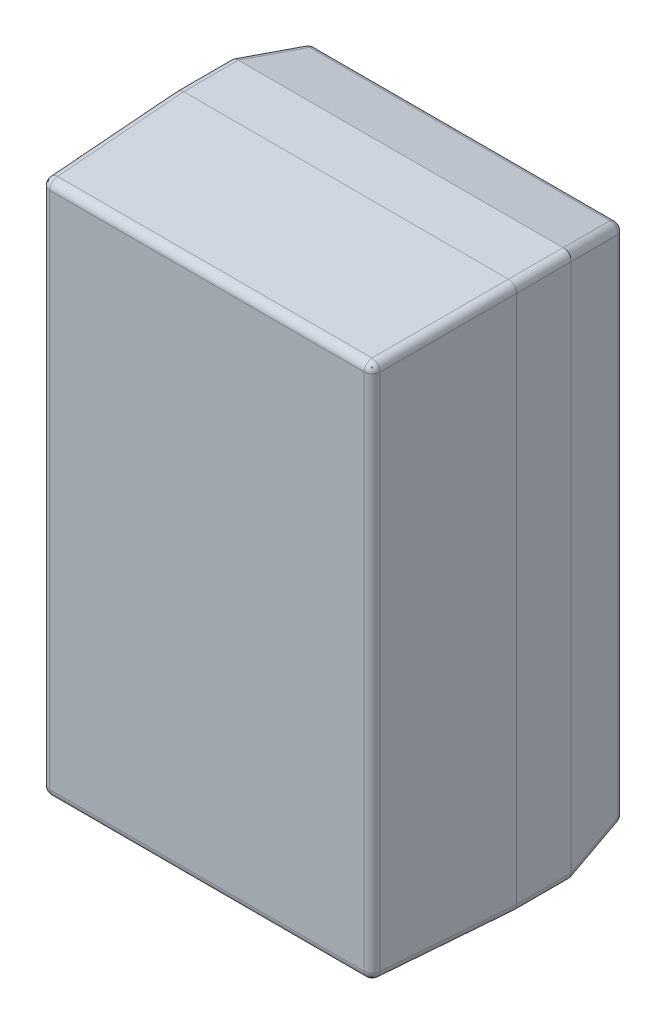
ISO-10303-21;
HEADER;
FILE_DESCRIPTION(('STEP AP214'),'2;1');
FILE_NAME('part.step','',(''),(''),'','','');
FILE_SCHEMA(('AUTOMOTIVE_DESIGN { 1 0 10303 214 1 1 1 1 }'));
ENDSEC;
DATA;
#1=APPLICATION_CONTEXT('core data for automotive mechanical design processes');
#2=APPLICATION_PROTOCOL_DEFINITION('international standard','automotive_design',2000,#1);
#3=PRODUCT_CONTEXT('',#1,'mechanical');
#4=PRODUCT('Part','Part','',(#3));
#5=PRODUCT_RELATED_PRODUCT_CATEGORY('part','',(#4));
#6=PRODUCT_DEFINITION_FORMATION('','',#4);
#7=PRODUCT_DEFINITION_CONTEXT('part definition',#1,'design');
#8=PRODUCT_DEFINITION('design','',#6,#7);
#9=PRODUCT_DEFINITION_SHAPE('','',#8);
#10=(LENGTH_UNIT() NAMED_UNIT(*) SI_UNIT(.MILLI.,.METRE.));
#11=(NAMED_UNIT(*) PLANE_ANGLE_UNIT() SI_UNIT($,.RADIAN.));
#12=(NAMED_UNIT(*) SI_UNIT($,.STERADIAN.) SOLID_ANGLE_UNIT());
#13=UNCERTAINTY_MEASURE_WITH_UNIT(LENGTH_MEASURE(1.E-05),#10,'distance_accuracy_value','');
#14=(GEOMETRIC_REPRESENTATION_CONTEXT(3) GLOBAL_UNCERTAINTY_ASSIGNED_CONTEXT((#13)) GLOBAL_UNIT_ASSIGNED_CONTEXT((#10,
#11,#12)) REPRESENTATION_CONTEXT('',''));
#15=CARTESIAN_POINT('',(0.,0.,0.));
#16=DIRECTION('',(0.,0.,1.));
#17=DIRECTION('',(1.,0.,0.));
#18=AXIS2_PLACEMENT_3D('',#15,#16,#17);
#19=CARTESIAN_POINT('',(0.69939346668,3.07439355148,-2.581602148866));
#20=DIRECTION('',(-0.495788828813103,-0.495788766478835,-0.713012577909763));
#21=DIRECTION('',(-2.39253061806721E-13,-0.821023932129786,0.570893775469784));
#22=AXIS2_PLACEMENT_3D('',#19,#20,#21);
#23=SPHERICAL_SURFACE('',#22,0.03);
#24=CARTESIAN_POINT('',(0.684519801815607,3.05951988848564,-2.60299252620329));
#25=VERTEX_POINT('',#24);
#26=VERTEX_LOOP('',#25);
#27=FACE_BOUND('',#26,.T.);
#28=CARTESIAN_POINT('',(0.699393466680533,3.07439355148056,-2.58160214886647));
#29=DIRECTION('',(0.199840191744084,0.199840275603084,-0.959232902902403));
#30=DIRECTION('',(0.,0.978980401907373,0.203954339697095));
#31=AXIS2_PLACEMENT_3D('',#28,#29,#30);
#32=CIRCLE('',#31,0.03);
#33=CARTESIAN_POINT('',(0.670024021774446,3.07439392426915,-2.58772062138399));
#34=VERTEX_POINT('',#33);
#35=CARTESIAN_POINT('',(0.699393466680054,3.04502413942317,-2.58772077905723));
#36=VERTEX_POINT('',#35);
#37=EDGE_CURVE('E132',#34,#36,#32,.F.);
#38=ORIENTED_EDGE('',*,*,#37,.F.);
#39=CARTESIAN_POINT('',(0.69939346668,3.07439355148032,-2.58160214886634));
#40=DIRECTION('',(0.,-0.999999999999996,-8.74227766353597E-08));
#41=DIRECTION('',(0.,8.74227766353597E-08,-0.999999999999996));
#42=AXIS2_PLACEMENT_3D('',#39,#40,#41);
#43=CIRCLE('',#42,0.03);
#44=CARTESIAN_POINT('',(0.69939346668,3.07439355410284,-2.61160214886617));
#45=VERTEX_POINT('',#44);
#46=EDGE_CURVE('E134',#45,#34,#43,.F.);
#47=ORIENTED_EDGE('',*,*,#46,.F.);
#48=CARTESIAN_POINT('',(0.69939346668,3.07439355148,-2.581602148866));
#49=DIRECTION('',(1.,0.,0.));
#50=DIRECTION('',(0.,1.,0.));
#51=AXIS2_PLACEMENT_3D('',#48,#49,#50);
#52=CIRCLE('',#51,0.03);
#53=EDGE_CURVE('E136',#36,#45,#52,.T.);
#54=ORIENTED_EDGE('',*,*,#53,.F.);
#55=EDGE_LOOP('',(#38,#47,#54));
#56=FACE_BOUND('',#55,.T.);
#57=ADVANCED_FACE('F17',(#27,#56),#23,.T.);
#58=CARTESIAN_POINT('',(0.69939346668,4.92560529812,-2.581601987028));
#59=DIRECTION('',(-0.495788828813108,0.495788891146105,-0.71301249122315));
#60=DIRECTION('',(4.70734562441066E-13,-0.8210238323113,-0.570893919022497));
#61=AXIS2_PLACEMENT_3D('',#58,#59,#60);
#62=SPHERICAL_SURFACE('',#61,0.03);
#63=CARTESIAN_POINT('',(0.684519801815607,4.94047896485438,-2.60299236176469));
#64=VERTEX_POINT('',#63);
#65=VERTEX_LOOP('',#64);
#66=FACE_BOUND('',#65,.T.);
#67=CARTESIAN_POINT('',(0.699393466679999,4.92560529812009,-2.58160198702827));
#68=DIRECTION('',(0.,-0.999999999999996,-8.74227766353597E-08));
#69=DIRECTION('',(0.,8.74227766353597E-08,-0.999999999999996));
#70=AXIS2_PLACEMENT_3D('',#67,#68,#69);
#71=CIRCLE('',#70,0.03);
#72=CARTESIAN_POINT('',(0.670024054088028,4.92560529865505,-2.58772061465177));
#73=VERTEX_POINT('',#72);
#74=CARTESIAN_POINT('',(0.69939346668,4.92560530074239,-2.61160198702814));
#75=VERTEX_POINT('',#74);
#76=EDGE_CURVE('E231',#73,#75,#71,.T.);
#77=ORIENTED_EDGE('',*,*,#76,.F.);
#78=CARTESIAN_POINT('',(0.699393466680197,4.9256052981197,-2.58160198702808));
#79=DIRECTION('',(-0.199840191744092,0.199840107886092,0.959232937843442));
#80=DIRECTION('',(0.978980420479347,0.,0.203954250551637));
#81=AXIS2_PLACEMENT_3D('',#78,#79,#80);
#82=CIRCLE('',#81,0.03);
#83=CARTESIAN_POINT('',(0.69939346668,4.95497471124687,-2.58772061208397));
#84=VERTEX_POINT('',#83);
#85=EDGE_CURVE('E226',#84,#73,#82,.T.);
#86=ORIENTED_EDGE('',*,*,#85,.F.);
#87=CARTESIAN_POINT('',(0.69939346668,4.92560529812,-2.581601987028));
#88=DIRECTION('',(-1.,0.,0.));
#89=DIRECTION('',(0.,-1.,0.));
#90=AXIS2_PLACEMENT_3D('',#87,#88,#89);
#91=CIRCLE('',#90,0.03);
#92=EDGE_CURVE('E141',#75,#84,#91,.F.);
#93=ORIENTED_EDGE('',*,*,#92,.F.);
#94=EDGE_LOOP('',(#77,#86,#93));
#95=FACE_BOUND('',#94,.T.);
#96=ADVANCED_FACE('F128',(#66,#95),#62,.T.);
#97=CARTESIAN_POINT('',(1.80060521332,3.07439355148,-2.581602148866));
#98=DIRECTION('',(0.495788828813103,-0.495788766478835,-0.713012577909763));
#99=DIRECTION('',(2.39253061806721E-13,-0.821023932129786,0.570893775469784));
#100=AXIS2_PLACEMENT_3D('',#97,#98,#99);
#101=SPHERICAL_SURFACE('',#100,0.03);
#102=CARTESIAN_POINT('',(1.81547887818439,3.05951988848564,-2.60299252620329));
#103=VERTEX_POINT('',#102);
#104=VERTEX_LOOP('',#103);
#105=FACE_BOUND('',#104,.T.);
#106=CARTESIAN_POINT('',(1.80060521331983,3.07439355147999,-2.5816021488661));
#107=DIRECTION('',(-0.199840191744084,0.199840275603084,-0.959232902902403));
#108=DIRECTION('',(0.,0.978980401907373,0.203954339697095));
#109=AXIS2_PLACEMENT_3D('',#106,#107,#108);
#110=CIRCLE('',#109,0.03);
#111=CARTESIAN_POINT('',(1.80060521332,3.04502413942289,-2.58772077905702));
#112=VERTEX_POINT('',#111);
#113=CARTESIAN_POINT('',(1.82997462591201,3.07439355201495,-2.58772077648973));
#114=VERTEX_POINT('',#113);
#115=EDGE_CURVE('E330',#112,#114,#110,.F.);
#116=ORIENTED_EDGE('',*,*,#115,.F.);
#117=CARTESIAN_POINT('',(1.80060521332,3.07439355148,-2.581602148866));
#118=DIRECTION('',(1.,0.,0.));
#119=DIRECTION('',(0.,1.,0.));
#120=AXIS2_PLACEMENT_3D('',#117,#118,#119);
#121=CIRCLE('',#120,0.03);
#122=CARTESIAN_POINT('',(1.80060521332,3.07439355410284,-2.61160214886636));
#123=VERTEX_POINT('',#122);
#124=EDGE_CURVE('E21',#123,#112,#121,.F.);
#125=ORIENTED_EDGE('',*,*,#124,.F.);
#126=CARTESIAN_POINT('',(1.80060521332,3.07439355148009,-2.58160214886673));
#127=DIRECTION('',(0.,0.999999999999996,8.74227766353597E-08));
#128=DIRECTION('',(0.,-8.74227766353597E-08,0.999999999999996));
#129=AXIS2_PLACEMENT_3D('',#126,#127,#128);
#130=CIRCLE('',#129,0.03);
#131=EDGE_CURVE('E325',#114,#123,#130,.T.);
#132=ORIENTED_EDGE('',*,*,#131,.F.);
#133=EDGE_LOOP('',(#116,#125,#132));
#134=FACE_BOUND('',#133,.T.);
#135=ADVANCED_FACE('F215',(#105,#134),#101,.T.);
#136=CARTESIAN_POINT('',(1.24999934,3.999999427423,-2.611602067947));
#137=DIRECTION('',(0.,8.74227766353597E-08,-0.999999999999996));
#138=DIRECTION('',(0.,0.999999999999996,8.74227766353597E-08));
#139=AXIS2_PLACEMENT_3D('',#136,#137,#138);
#140=PLANE('',#139);
#141=DIRECTION('',(-1.,0.,0.));
#142=VECTOR('',#141,1.);
#143=CARTESIAN_POINT('',(1.09374934,4.925605300742,-2.611601987028));
#144=LINE('',#143,#142);
#145=CARTESIAN_POINT('',(1.80060521332,4.92560530074234,-2.61160198702833));
#146=VERTEX_POINT('',#145);
#147=EDGE_CURVE('E224',#146,#75,#144,.T.);
#148=ORIENTED_EDGE('',*,*,#147,.F.);
#149=DIRECTION('',(0.,0.999999999999996,8.74227766353597E-08));
#150=VECTOR('',#149,1.);
#151=CARTESIAN_POINT('',(1.80060521332,4.24999942742268,-2.611602046092));
#152=LINE('',#151,#150);
#153=EDGE_CURVE('E223',#123,#146,#152,.T.);
#154=ORIENTED_EDGE('',*,*,#153,.F.);
#155=DIRECTION('',(1.,0.,0.));
#156=VECTOR('',#155,1.);
#157=CARTESIAN_POINT('',(1.40624934,3.074393554103,-2.611602148866));
#158=LINE('',#157,#156);
#159=EDGE_CURVE('E110',#45,#123,#158,.T.);
#160=ORIENTED_EDGE('',*,*,#159,.F.);
#161=DIRECTION('',(0.,-0.999999999999996,-8.74227766353597E-08));
#162=VECTOR('',#161,1.);
#163=CARTESIAN_POINT('',(0.69939346668,3.74999942742268,-2.611602089803));
#164=LINE('',#163,#162);
#165=EDGE_CURVE('E142',#75,#45,#164,.T.);
#166=ORIENTED_EDGE('',*,*,#165,.F.);
#167=EDGE_LOOP('',(#148,#154,#160,#166));
#168=FACE_BOUND('',#167,.T.);
#169=ADVANCED_FACE('F211',(#168),#140,.T.);
#170=CARTESIAN_POINT('',(1.80060521332,4.92560529812,-2.581601987028));
#171=DIRECTION('',(0.495788828813108,0.495788891146105,-0.71301249122315));
#172=DIRECTION('',(-4.70734562441066E-13,-0.8210238323113,-0.570893919022497));
#173=AXIS2_PLACEMENT_3D('',#170,#171,#172);
#174=SPHERICAL_SURFACE('',#173,0.03);
#175=CARTESIAN_POINT('',(1.81547887818439,4.94047896485438,-2.60299236176469));
#176=VERTEX_POINT('',#175);
#177=VERTEX_LOOP('',#176);
#178=FACE_BOUND('',#177,.T.);
#179=CARTESIAN_POINT('',(1.8006052133193,4.92560529811935,-2.58160198702837));
#180=DIRECTION('',(-0.199840191744092,-0.199840107886092,-0.959232937843442));
#181=DIRECTION('',(-0.978980420479347,0.,0.203954250551637));
#182=AXIS2_PLACEMENT_3D('',#179,#180,#181);
#183=CIRCLE('',#182,0.03);
#184=CARTESIAN_POINT('',(1.82997459359801,4.9256056709095,-2.58772076975792));
#185=VERTEX_POINT('',#184);
#186=CARTESIAN_POINT('',(1.80060521331996,4.95497471124655,-2.58772061208413));
#187=VERTEX_POINT('',#186);
#188=EDGE_CURVE('E180',#185,#187,#183,.F.);
#189=ORIENTED_EDGE('',*,*,#188,.F.);
#190=CARTESIAN_POINT('',(1.80060521332,4.92560529811932,-2.58160198702866));
#191=DIRECTION('',(0.,0.999999999999996,8.74227766353597E-08));
#192=DIRECTION('',(0.,-8.74227766353597E-08,0.999999999999996));
#193=AXIS2_PLACEMENT_3D('',#190,#191,#192);
#194=CIRCLE('',#193,0.03);
#195=EDGE_CURVE('E328',#146,#185,#194,.F.);
#196=ORIENTED_EDGE('',*,*,#195,.F.);
#197=CARTESIAN_POINT('',(1.80060521332,4.92560529812,-2.581601987028));
#198=DIRECTION('',(-1.,0.,0.));
#199=DIRECTION('',(0.,-1.,0.));
#200=AXIS2_PLACEMENT_3D('',#197,#198,#199);
#201=CIRCLE('',#200,0.03);
#202=EDGE_CURVE('E227',#187,#146,#201,.T.);
#203=ORIENTED_EDGE('',*,*,#202,.F.);
#204=EDGE_LOOP('',(#189,#196,#203));
#205=FACE_BOUND('',#204,.T.);
#206=ADVANCED_FACE('F206',(#178,#205),#174,.T.);
#207=CARTESIAN_POINT('',(1.40624934,3.07439355148,-2.581602148866));
#208=DIRECTION('',(1.,0.,0.));
#209=DIRECTION('',(0.,1.,0.));
#210=AXIS2_PLACEMENT_3D('',#207,#208,#209);
#211=CYLINDRICAL_SURFACE('',#210,0.03);
#212=ORIENTED_EDGE('',*,*,#53,.T.);
#213=ORIENTED_EDGE('',*,*,#159,.T.);
#214=ORIENTED_EDGE('',*,*,#124,.T.);
#215=DIRECTION('',(1.,0.,0.));
#216=VECTOR('',#215,1.);
#217=CARTESIAN_POINT('',(1.56249934,3.04502413942299,-2.587720779057));
#218=LINE('',#217,#216);
#219=EDGE_CURVE('E175',#36,#112,#218,.T.);
#220=ORIENTED_EDGE('',*,*,#219,.F.);
#221=EDGE_LOOP('',(#212,#213,#214,#220));
#222=FACE_BOUND('',#221,.T.);
#223=ADVANCED_FACE('F210',(#222),#211,.T.);
#224=CARTESIAN_POINT('',(0.69939346668,3.7499994248,-2.581602089803));
#225=DIRECTION('',(0.,-0.999999999999996,-8.74227766353597E-08));
#226=DIRECTION('',(0.,8.74227766353597E-08,-0.999999999999996));
#227=AXIS2_PLACEMENT_3D('',#224,#225,#226);
#228=CYLINDRICAL_SURFACE('',#227,0.03);
#229=ORIENTED_EDGE('',*,*,#76,.T.);
#230=ORIENTED_EDGE('',*,*,#165,.T.);
#231=ORIENTED_EDGE('',*,*,#46,.T.);
#232=DIRECTION('',(1.74554622238911E-08,1.,3.63655462997583E-09));
#233=VECTOR('',#232,1.);
#234=CARTESIAN_POINT('',(0.670024029203586,3.499999416932,-2.58772061983625));
#235=LINE('',#234,#233);
#236=EDGE_CURVE('E156',#73,#34,#235,.F.);
#237=ORIENTED_EDGE('',*,*,#236,.F.);
#238=EDGE_LOOP('',(#229,#230,#231,#237));
#239=FACE_BOUND('',#238,.T.);
#240=ADVANCED_FACE('F551',(#239),#228,.T.);
#241=CARTESIAN_POINT('',(0.705901523655,3.080901611186,-2.612840821775));
#242=DIRECTION('',(0.199840191744084,0.199840275603084,-0.959232902902403));
#243=DIRECTION('',(0.,0.978980401907373,0.203954339697095));
#244=AXIS2_PLACEMENT_3D('',#241,#242,#243);
#245=CYLINDRICAL_SURFACE('',#244,0.03);
#246=DIRECTION('',(0.199840191745187,0.199840275603023,-0.959232902902186));
#247=VECTOR('',#246,1.);
#248=CARTESIAN_POINT('',(0.654375244873,3.00000589872524,-2.37163331831995));
#249=LINE('',#248,#247);
#250=CARTESIAN_POINT('',(0.654687292436501,3.00000265258324,-2.37161773684497));
#251=VERTEX_POINT('',#250);
#252=EDGE_CURVE('E178',#251,#36,#249,.T.);
#253=ORIENTED_EDGE('',*,*,#252,.F.);
#254=CARTESIAN_POINT('',(0.654999339999994,3.02999940617088,-2.3685103446806));
#255=DIRECTION('',(0.10095429612821,0.100954382655504,-0.98975574901887));
#256=DIRECTION('',(-0.69986300808999,-0.69986299560924,-0.14277099594838));
#257=AXIS2_PLACEMENT_3D('',#254,#255,#256);
#258=ELLIPSE('',#257,0.0303105081857083,0.03);
#259=CARTESIAN_POINT('',(0.625002586140661,3.029687358879,-2.37161764944948));
#260=VERTEX_POINT('',#259);
#261=EDGE_CURVE('E150',#260,#251,#258,.F.);
#262=ORIENTED_EDGE('',*,*,#261,.F.);
#263=DIRECTION('',(-0.199840191744275,-0.199840275603291,0.95923290290232));
#264=VECTOR('',#263,1.);
#265=CARTESIAN_POINT('',(0.670024054088183,3.074393552015,-2.58772077648996));
#266=LINE('',#265,#264);
#267=EDGE_CURVE('E146',#34,#260,#266,.T.);
#268=ORIENTED_EDGE('',*,*,#267,.F.);
#269=ORIENTED_EDGE('',*,*,#37,.T.);
#270=EDGE_LOOP('',(#253,#262,#268,#269));
#271=FACE_BOUND('',#270,.T.);
#272=ADVANCED_FACE('F147',(#271),#245,.T.);
#273=CARTESIAN_POINT('',(1.09374934,4.92560529812,-2.581601987028));
#274=DIRECTION('',(-1.,0.,0.));
#275=DIRECTION('',(0.,-1.,0.));
#276=AXIS2_PLACEMENT_3D('',#273,#274,#275);
#277=CYLINDRICAL_SURFACE('',#276,0.03);
#278=ORIENTED_EDGE('',*,*,#202,.T.);
#279=ORIENTED_EDGE('',*,*,#147,.T.);
#280=ORIENTED_EDGE('',*,*,#92,.T.);
#281=DIRECTION('',(1.,0.,0.));
#282=VECTOR('',#281,1.);
#283=CARTESIAN_POINT('',(0.93749934,4.95497471124675,-2.58772061208395));
#284=LINE('',#283,#282);
#285=EDGE_CURVE('E195',#187,#84,#284,.F.);
#286=ORIENTED_EDGE('',*,*,#285,.F.);
#287=EDGE_LOOP('',(#278,#279,#280,#286));
#288=FACE_BOUND('',#287,.T.);
#289=ADVANCED_FACE('F545',(#288),#277,.T.);
#290=CARTESIAN_POINT('',(0.713389542824,4.911609227849,-2.648783153742));
#291=DIRECTION('',(-0.199840191744092,0.199840107886092,0.959232937843442));
#292=DIRECTION('',(0.978980420479347,0.,0.203954250551637));
#293=AXIS2_PLACEMENT_3D('',#290,#291,#292);
#294=CYLINDRICAL_SURFACE('',#293,0.03);
#295=DIRECTION('',(0.199840191744279,-0.199840107885589,-0.959232937843507));
#296=VECTOR('',#295,1.);
#297=CARTESIAN_POINT('',(0.625005832281257,4.970623501571,-2.37163314604295));
#298=LINE('',#297,#296);
#299=CARTESIAN_POINT('',(0.625002586140636,4.970311445264,-2.37161756459498));
#300=VERTEX_POINT('',#299);
#301=EDGE_CURVE('E160',#300,#73,#298,.T.);
#302=ORIENTED_EDGE('',*,*,#301,.F.);
#303=CARTESIAN_POINT('',(0.654999340000029,4.96999940617091,-2.36851017508209));
#304=DIRECTION('',(0.100954296128217,-0.100954209601427,-0.989755766670246));
#305=DIRECTION('',(-0.699863008088897,0.699863020573149,-0.142770873580674));
#306=AXIS2_PLACEMENT_3D('',#303,#304,#305);
#307=ELLIPSE('',#306,0.0303105081857093,0.03);
#308=CARTESIAN_POINT('',(0.654687292436501,4.99999616030195,-2.37161756199999));
#309=VERTEX_POINT('',#308);
#310=EDGE_CURVE('E315',#309,#300,#307,.F.);
#311=ORIENTED_EDGE('',*,*,#310,.F.);
#312=DIRECTION('',(-0.199840191744548,0.199840107885689,0.95923293784343));
#313=VECTOR('',#312,1.);
#314=CARTESIAN_POINT('',(0.69939346668,4.95497471124675,-2.58772061208395));
#315=LINE('',#314,#313);
#316=EDGE_CURVE('E197',#84,#309,#315,.T.);
#317=ORIENTED_EDGE('',*,*,#316,.F.);
#318=ORIENTED_EDGE('',*,*,#85,.T.);
#319=EDGE_LOOP('',(#302,#311,#317,#318));
#320=FACE_BOUND('',#319,.T.);
#321=ADVANCED_FACE('F542',(#320),#294,.T.);
#322=CARTESIAN_POINT('',(1.786609137176,3.088389633497,-2.648783313133));
#323=DIRECTION('',(-0.199840191744084,0.199840275603084,-0.959232902902403));
#324=DIRECTION('',(0.,0.978980401907373,0.203954339697095));
#325=AXIS2_PLACEMENT_3D('',#322,#323,#324);
#326=CYLINDRICAL_SURFACE('',#325,0.03);
#327=DIRECTION('',(-0.199840191744276,0.19984027560329,-0.95923290290232));
#328=VECTOR('',#327,1.);
#329=CARTESIAN_POINT('',(1.87499284771876,3.029375311317,-2.37163331575195));
#330=LINE('',#329,#328);
#331=CARTESIAN_POINT('',(1.87499609385938,3.029687350137,-2.37161773424948));
#332=VERTEX_POINT('',#331);
#333=EDGE_CURVE('E194',#332,#114,#330,.T.);
#334=ORIENTED_EDGE('',*,*,#333,.F.);
#335=CARTESIAN_POINT('',(1.84499933999996,3.02999940617083,-2.36851034468245));
#336=DIRECTION('',(-0.10095429612821,0.100954382655504,-0.98975574901887));
#337=DIRECTION('',(0.699863008089989,-0.69986299560924,-0.14277099594838));
#338=AXIS2_PLACEMENT_3D('',#335,#336,#337);
#339=ELLIPSE('',#338,0.0303105081857083,0.03);
#340=CARTESIAN_POINT('',(1.8453113875635,3.00000265258316,-2.37161773684499));
#341=VERTEX_POINT('',#340);
#342=EDGE_CURVE('E312',#341,#332,#339,.F.);
#343=ORIENTED_EDGE('',*,*,#342,.F.);
#344=DIRECTION('',(0.199840191745187,-0.199840275603023,0.959232902902186));
#345=VECTOR('',#344,1.);
#346=CARTESIAN_POINT('',(1.80060521332,3.04502413942299,-2.587720779057));
#347=LINE('',#346,#345);
#348=EDGE_CURVE('E170',#112,#341,#347,.T.);
#349=ORIENTED_EDGE('',*,*,#348,.F.);
#350=ORIENTED_EDGE('',*,*,#115,.T.);
#351=EDGE_LOOP('',(#334,#343,#349,#350));
#352=FACE_BOUND('',#351,.T.);
#353=ADVANCED_FACE('F349',(#352),#326,.T.);
#354=CARTESIAN_POINT('',(1.80060521332,4.2499994248,-2.581602046092));
#355=DIRECTION('',(0.,0.999999999999996,8.74227766353597E-08));
#356=DIRECTION('',(0.,-8.74227766353597E-08,0.999999999999996));
#357=AXIS2_PLACEMENT_3D('',#354,#355,#356);
#358=CYLINDRICAL_SURFACE('',#357,0.03);
#359=ORIENTED_EDGE('',*,*,#131,.T.);
#360=ORIENTED_EDGE('',*,*,#153,.T.);
#361=ORIENTED_EDGE('',*,*,#195,.T.);
#362=DIRECTION('',(-1.7455463686948E-08,1.,3.63655493477935E-09));
#363=VECTOR('',#362,1.);
#364=CARTESIAN_POINT('',(1.82997460102716,4.499999416932,-2.58772077130566));
#365=LINE('',#364,#363);
#366=EDGE_CURVE('E190',#114,#185,#365,.T.);
#367=ORIENTED_EDGE('',*,*,#366,.F.);
#368=EDGE_LOOP('',(#359,#360,#361,#367));
#369=FACE_BOUND('',#368,.T.);
#370=ADVANCED_FACE('F535',(#369),#358,.T.);
#371=CARTESIAN_POINT('',(1.794097156345,4.919097243876,-2.612840661074));
#372=DIRECTION('',(-0.199840191744092,-0.199840107886092,-0.959232937843442));
#373=DIRECTION('',(-0.978980420479347,0.,0.203954250551637));
#374=AXIS2_PLACEMENT_3D('',#371,#372,#373);
#375=CYLINDRICAL_SURFACE('',#374,0.03);
#376=DIRECTION('',(-0.199840191744548,-0.199840107885689,-0.95923293784343));
#377=VECTOR('',#376,1.);
#378=CARTESIAN_POINT('',(1.845623435127,4.99999291416277,-2.37163314347495));
#379=LINE('',#378,#377);
#380=CARTESIAN_POINT('',(1.8453113875635,4.99999616030191,-2.37161756199998));
#381=VERTEX_POINT('',#380);
#382=EDGE_CURVE('E158',#381,#187,#379,.T.);
#383=ORIENTED_EDGE('',*,*,#382,.F.);
#384=CARTESIAN_POINT('',(1.84499933999993,4.96999940617095,-2.36851017508035));
#385=DIRECTION('',(-0.100954296128217,-0.100954209601427,-0.989755766670246));
#386=DIRECTION('',(0.699863008088897,0.699863020573149,-0.142770873580674));
#387=AXIS2_PLACEMENT_3D('',#384,#385,#386);
#388=ELLIPSE('',#387,0.0303105081857093,0.03);
#389=CARTESIAN_POINT('',(1.87499609385928,4.970311454006,-2.37161764939497));
#390=VERTEX_POINT('',#389);
#391=EDGE_CURVE('E306',#390,#381,#388,.F.);
#392=ORIENTED_EDGE('',*,*,#391,.F.);
#393=DIRECTION('',(0.199840191744278,0.199840107885589,0.959232937843507));
#394=VECTOR('',#393,1.);
#395=CARTESIAN_POINT('',(1.82997462591176,4.925605298655,-2.58772061465195));
#396=LINE('',#395,#394);
#397=EDGE_CURVE('E193',#185,#390,#396,.T.);
#398=ORIENTED_EDGE('',*,*,#397,.F.);
#399=ORIENTED_EDGE('',*,*,#188,.T.);
#400=EDGE_LOOP('',(#383,#392,#398,#399));
#401=FACE_BOUND('',#400,.T.);
#402=ADVANCED_FACE('F532',(#401),#375,.T.);
#403=CARTESIAN_POINT('',(1.56249934,3.024999416932,-2.491602153185));
#404=DIRECTION('',(0.,-0.978980401907377,-0.203954339697078));
#405=DIRECTION('',(0.,0.203954339697078,-0.978980401907377));
#406=AXIS2_PLACEMENT_3D('',#403,#404,#405);
#407=PLANE('',#406);
#408=ORIENTED_EDGE('',*,*,#219,.T.);
#409=ORIENTED_EDGE('',*,*,#348,.T.);
#410=DIRECTION('',(1.,0.,0.));
#411=VECTOR('',#410,1.);
#412=CARTESIAN_POINT('',(1.87499934,2.99999940644117,-2.37160215537));
#413=LINE('',#412,#411);
#414=EDGE_CURVE('E183',#251,#341,#413,.T.);
#415=ORIENTED_EDGE('',*,*,#414,.F.);
#416=ORIENTED_EDGE('',*,*,#252,.T.);
#417=EDGE_LOOP('',(#408,#409,#415,#416));
#418=FACE_BOUND('',#417,.T.);
#419=ADVANCED_FACE('F341',(#418),#407,.T.);
#420=CARTESIAN_POINT('',(0.64999934,3.499999416932,-2.491602111659));
#421=DIRECTION('',(-0.978980419737622,1.78302465217531E-08,-0.203954254111921));
#422=DIRECTION('',(-0.203954254111921,0.,0.978980419737622));
#423=AXIS2_PLACEMENT_3D('',#420,#421,#422);
#424=PLANE('',#423);
#425=ORIENTED_EDGE('',*,*,#267,.T.);
#426=DIRECTION('',(0.,-1.,0.));
#427=VECTOR('',#426,1.);
#428=CARTESIAN_POINT('',(0.62499934,2.999999344371,-2.371601983147));
#429=LINE('',#428,#427);
#430=EDGE_CURVE('E397',#300,#260,#429,.T.);
#431=ORIENTED_EDGE('',*,*,#430,.F.);
#432=ORIENTED_EDGE('',*,*,#301,.T.);
#433=ORIENTED_EDGE('',*,*,#236,.T.);
#434=EDGE_LOOP('',(#425,#431,#432,#433));
#435=FACE_BOUND('',#434,.T.);
#436=ADVANCED_FACE('F526',(#435),#424,.T.);
#437=CARTESIAN_POINT('',(0.65499934,3.029999344371,-1.661602152747));
#438=DIRECTION('',(0.,8.74227766353597E-08,-0.999999999999996));
#439=DIRECTION('',(0.,0.999999999999996,8.74227766353597E-08));
#440=AXIS2_PLACEMENT_3D('',#437,#438,#439);
#441=CYLINDRICAL_SURFACE('',#440,0.03);
#442=DIRECTION('',(0.,8.74227766353597E-08,-0.999999999999996));
#443=VECTOR('',#442,1.);
#444=CARTESIAN_POINT('',(0.65499934,2.999999344371,-1.66160215537));
#445=LINE('',#444,#443);
#446=CARTESIAN_POINT('',(0.654987820351157,2.99999939190477,-2.17160211781105));
#447=VERTEX_POINT('',#446);
#448=EDGE_CURVE('E187',#447,#251,#445,.T.);
#449=ORIENTED_EDGE('',*,*,#448,.F.);
#450=CARTESIAN_POINT('',(0.654999339999912,3.02999938900811,-2.17219016205214));
#451=DIRECTION('',(0.0195852722215487,0.0195851848323129,0.999616345228054));
#452=DIRECTION('',(0.706835495084954,0.706835497506389,-0.0276976958049623));
#453=AXIS2_PLACEMENT_3D('',#450,#451,#452);
#454=ELLIPSE('',#453,0.030011514111988,0.03);
#455=CARTESIAN_POINT('',(0.624999344420944,3.02998787662928,-2.17160207758972));
#456=VERTEX_POINT('',#455);
#457=EDGE_CURVE('E299',#456,#447,#454,.T.);
#458=ORIENTED_EDGE('',*,*,#457,.F.);
#459=DIRECTION('',(0.,0.,1.));
#460=VECTOR('',#459,1.);
#461=CARTESIAN_POINT('',(0.62499934,3.029999406441,-1.66160215537));
#462=LINE('',#461,#460);
#463=EDGE_CURVE('E303',#260,#456,#462,.T.);
#464=ORIENTED_EDGE('',*,*,#463,.F.);
#465=ORIENTED_EDGE('',*,*,#261,.T.);
#466=EDGE_LOOP('',(#449,#458,#464,#465));
#467=FACE_BOUND('',#466,.T.);
#468=ADVANCED_FACE('F522',(#467),#441,.T.);
#469=CARTESIAN_POINT('',(0.93749934,4.974999416932,-2.49160198271));
#470=DIRECTION('',(0.,0.978980437567818,-0.203954168526962));
#471=DIRECTION('',(0.,0.203954168526962,0.978980437567818));
#472=AXIS2_PLACEMENT_3D('',#469,#470,#471);
#473=PLANE('',#472);
#474=ORIENTED_EDGE('',*,*,#316,.T.);
#475=DIRECTION('',(1.,0.,0.));
#476=VECTOR('',#475,1.);
#477=CARTESIAN_POINT('',(0.62499934,4.99999940644117,-2.371601980525));
#478=LINE('',#477,#476);
#479=EDGE_CURVE('E385',#381,#309,#478,.F.);
#480=ORIENTED_EDGE('',*,*,#479,.F.);
#481=ORIENTED_EDGE('',*,*,#382,.T.);
#482=ORIENTED_EDGE('',*,*,#285,.T.);
#483=EDGE_LOOP('',(#474,#480,#481,#482));
#484=FACE_BOUND('',#483,.T.);
#485=ADVANCED_FACE('F518',(#484),#473,.T.);
#486=CARTESIAN_POINT('',(0.65499934,4.969999344371,-1.661601983147));
#487=DIRECTION('',(0.,8.74227766353597E-08,-0.999999999999996));
#488=DIRECTION('',(0.,0.999999999999996,8.74227766353597E-08));
#489=AXIS2_PLACEMENT_3D('',#486,#487,#488);
#490=CYLINDRICAL_SURFACE('',#489,0.03);
#491=DIRECTION('',(0.,0.,1.));
#492=VECTOR('',#491,1.);
#493=CARTESIAN_POINT('',(0.624999339999999,4.969999388957,-1.66160215537));
#494=LINE('',#493,#492);
#495=CARTESIAN_POINT('',(0.624999342948167,4.97001090849746,-2.17160198798594));
#496=VERTEX_POINT('',#495);
#497=EDGE_CURVE('E186',#496,#300,#494,.F.);
#498=ORIENTED_EDGE('',*,*,#497,.F.);
#499=CARTESIAN_POINT('',(0.654999340000049,4.96999938900807,-2.17218999246418));
#500=DIRECTION('',(0.0195852722215454,-0.0195853596107811,0.999616341803656));
#501=DIRECTION('',(0.706835495084974,-0.706835492663539,-0.0276978193919996));
#502=AXIS2_PLACEMENT_3D('',#499,#500,#501);
#503=ELLIPSE('',#502,0.030011514111988,0.03);
#504=CARTESIAN_POINT('',(0.654987823298751,4.99999938453566,-2.17160190536622));
#505=VERTEX_POINT('',#504);
#506=EDGE_CURVE('E291',#505,#496,#503,.T.);
#507=ORIENTED_EDGE('',*,*,#506,.F.);
#508=DIRECTION('',(0.,-8.74227766353597E-08,0.999999999999996));
#509=VECTOR('',#508,1.);
#510=CARTESIAN_POINT('',(0.65499934,4.999999344371,-1.661601980525));
#511=LINE('',#510,#509);
#512=EDGE_CURVE('E296',#309,#505,#511,.T.);
#513=ORIENTED_EDGE('',*,*,#512,.F.);
#514=ORIENTED_EDGE('',*,*,#310,.T.);
#515=EDGE_LOOP('',(#498,#507,#513,#514));
#516=FACE_BOUND('',#515,.T.);
#517=ADVANCED_FACE('F515',(#516),#490,.T.);
#518=CARTESIAN_POINT('',(1.84499934,3.029999344371,-1.661602152747));
#519=DIRECTION('',(0.,8.74227766353597E-08,-0.999999999999996));
#520=DIRECTION('',(0.,0.999999999999996,8.74227766353597E-08));
#521=AXIS2_PLACEMENT_3D('',#518,#519,#520);
#522=CYLINDRICAL_SURFACE('',#521,0.03);
#523=DIRECTION('',(0.,0.,1.));
#524=VECTOR('',#523,1.);
#525=CARTESIAN_POINT('',(1.87499934,3.029999388957,-1.661601980525));
#526=LINE('',#525,#524);
#527=CARTESIAN_POINT('',(1.87499933778914,3.02998786897022,-2.17160208218708));
#528=VERTEX_POINT('',#527);
#529=EDGE_CURVE('E382',#528,#332,#526,.F.);
#530=ORIENTED_EDGE('',*,*,#529,.F.);
#531=CARTESIAN_POINT('',(1.84499934000005,3.02999938900807,-2.17219016206877));
#532=DIRECTION('',(-0.0195852722215487,0.0195851848323129,0.999616345228054));
#533=DIRECTION('',(-0.706835495084954,0.706835497506389,-0.0276976958049623));
#534=AXIS2_PLACEMENT_3D('',#531,#532,#533);
#535=ELLIPSE('',#534,0.030011514111988,0.03);
#536=CARTESIAN_POINT('',(1.84501085670125,2.99999939337777,-2.17160208021161));
#537=VERTEX_POINT('',#536);
#538=EDGE_CURVE('E287',#537,#528,#535,.T.);
#539=ORIENTED_EDGE('',*,*,#538,.F.);
#540=DIRECTION('',(0.,8.74227766353597E-08,-0.999999999999996));
#541=VECTOR('',#540,1.);
#542=CARTESIAN_POINT('',(1.84499934,2.999999344371,-1.66160215537));
#543=LINE('',#542,#541);
#544=EDGE_CURVE('E309',#341,#537,#543,.F.);
#545=ORIENTED_EDGE('',*,*,#544,.F.);
#546=ORIENTED_EDGE('',*,*,#342,.T.);
#547=EDGE_LOOP('',(#530,#539,#545,#546));
#548=FACE_BOUND('',#547,.T.);
#549=ADVANCED_FACE('F364',(#548),#522,.T.);
#550=CARTESIAN_POINT('',(1.84999934,4.499999416932,-2.491602024236));
#551=DIRECTION('',(0.978980419737622,1.78302480162231E-08,-0.203954254111921));
#552=DIRECTION('',(-0.203954254111921,0.,-0.978980419737622));
#553=AXIS2_PLACEMENT_3D('',#550,#551,#552);
#554=PLANE('',#553);
#555=ORIENTED_EDGE('',*,*,#366,.T.);
#556=ORIENTED_EDGE('',*,*,#397,.T.);
#557=DIRECTION('',(0.,1.,0.));
#558=VECTOR('',#557,1.);
#559=CARTESIAN_POINT('',(1.87499934,4.999999344371,-2.371602152747));
#560=LINE('',#559,#558);
#561=EDGE_CURVE('E284',#332,#390,#560,.T.);
#562=ORIENTED_EDGE('',*,*,#561,.F.);
#563=ORIENTED_EDGE('',*,*,#333,.T.);
#564=EDGE_LOOP('',(#555,#556,#562,#563));
#565=FACE_BOUND('',#564,.T.);
#566=ADVANCED_FACE('F508',(#565),#554,.T.);
#567=CARTESIAN_POINT('',(1.84499934,4.969999344371,-1.661601983147));
#568=DIRECTION('',(0.,8.74227766353597E-08,-0.999999999999996));
#569=DIRECTION('',(0.,0.999999999999996,8.74227766353597E-08));
#570=AXIS2_PLACEMENT_3D('',#567,#568,#569);
#571=CYLINDRICAL_SURFACE('',#570,0.03);
#572=DIRECTION('',(0.,-8.74227766353597E-08,0.999999999999996));
#573=VECTOR('',#572,1.);
#574=CARTESIAN_POINT('',(1.84499934,4.999999344371,-1.661601980525));
#575=LINE('',#574,#573);
#576=CARTESIAN_POINT('',(1.84501086010041,4.99999938674575,-2.17160195235915));
#577=VERTEX_POINT('',#576);
#578=EDGE_CURVE('E302',#577,#381,#575,.F.);
#579=ORIENTED_EDGE('',*,*,#578,.F.);
#580=CARTESIAN_POINT('',(1.84499934000016,4.96999938900786,-2.17218999245556));
#581=DIRECTION('',(0.0195852722215454,0.0195853596107811,-0.999616341803656));
#582=DIRECTION('',(0.706835495084974,0.706835492663539,0.0276978193919996));
#583=AXIS2_PLACEMENT_3D('',#580,#581,#582);
#584=ELLIPSE('',#583,0.030011514111988,0.03);
#585=CARTESIAN_POINT('',(1.87499933557907,4.97001091002658,-2.17160190798777));
#586=VERTEX_POINT('',#585);
#587=EDGE_CURVE('E280',#586,#577,#584,.F.);
#588=ORIENTED_EDGE('',*,*,#587,.F.);
#589=DIRECTION('',(0.,0.,1.));
#590=VECTOR('',#589,1.);
#591=CARTESIAN_POINT('',(1.87499934,4.969999406441,-1.661601980525));
#592=LINE('',#591,#590);
#593=EDGE_CURVE('E290',#390,#586,#592,.T.);
#594=ORIENTED_EDGE('',*,*,#593,.F.);
#595=ORIENTED_EDGE('',*,*,#391,.T.);
#596=EDGE_LOOP('',(#579,#588,#594,#595));
#597=FACE_BOUND('',#596,.T.);
#598=ADVANCED_FACE('F505',(#597),#571,.T.);
#599=CARTESIAN_POINT('',(1.87499934,2.999999344371,-1.66160215537));
#600=DIRECTION('',(0.,-0.999999999999996,-8.74227766353597E-08));
#601=DIRECTION('',(0.,8.74227766353597E-08,-0.999999999999996));
#602=AXIS2_PLACEMENT_3D('',#599,#600,#601);
#603=PLANE('',#602);
#604=ORIENTED_EDGE('',*,*,#448,.T.);
#605=ORIENTED_EDGE('',*,*,#414,.T.);
#606=ORIENTED_EDGE('',*,*,#544,.T.);
#607=DIRECTION('',(1.,0.,0.));
#608=VECTOR('',#607,1.);
#609=CARTESIAN_POINT('',(1.56249934,2.99999938895682,-2.17160215536999));
#610=LINE('',#609,#608);
#611=EDGE_CURVE('E435',#447,#537,#610,.T.);
#612=ORIENTED_EDGE('',*,*,#611,.F.);
#613=EDGE_LOOP('',(#604,#605,#606,#612));
#614=FACE_BOUND('',#613,.T.);
#615=ADVANCED_FACE('F359',(#614),#603,.T.);
#616=CARTESIAN_POINT('',(0.62499934,2.999999344371,-1.66160215537));
#617=DIRECTION('',(-1.,0.,0.));
#618=DIRECTION('',(0.,-1.,0.));
#619=AXIS2_PLACEMENT_3D('',#616,#617,#618);
#620=PLANE('',#619);
#621=ORIENTED_EDGE('',*,*,#463,.T.);
#622=DIRECTION('',(-3.4230806224982E-09,1.,1.34238455784166E-10));
#623=VECTOR('',#622,1.);
#624=CARTESIAN_POINT('',(0.624999345031954,3.499999366664,-2.17160198334433));
#625=LINE('',#624,#623);
#626=EDGE_CURVE('E446',#496,#456,#625,.F.);
#627=ORIENTED_EDGE('',*,*,#626,.F.);
#628=ORIENTED_EDGE('',*,*,#497,.T.);
#629=ORIENTED_EDGE('',*,*,#430,.T.);
#630=EDGE_LOOP('',(#621,#627,#628,#629));
#631=FACE_BOUND('',#630,.T.);
#632=ADVANCED_FACE('F499',(#631),#620,.T.);
#633=CARTESIAN_POINT('',(0.666016962441,3.041016986888,-1.891240788839));
#634=DIRECTION('',(0.0391555164097344,0.0391554291210944,0.998465671871111));
#635=DIRECTION('',(0.999231950736802,0.,-0.0391855665612271));
#636=AXIS2_PLACEMENT_3D('',#633,#634,#635);
#637=CYLINDRICAL_SURFACE('',#636,0.03);
#638=DIRECTION('',(0.0391555164097046,0.0391554291209319,0.998465671871119));
#639=VECTOR('',#638,1.);
#640=CARTESIAN_POINT('',(0.624999348841721,3.02997635632,-2.17160192728599));
#641=LINE('',#640,#639);
#642=CARTESIAN_POINT('',(0.64386897007826,3.04884593548657,-1.69042658409899));
#643=VERTEX_POINT('',#642);
#644=EDGE_CURVE('E279',#456,#643,#641,.T.);
#645=ORIENTED_EDGE('',*,*,#644,.F.);
#646=ORIENTED_EDGE('',*,*,#457,.T.);
#647=DIRECTION('',(-0.0391555164088024,-0.0391554291210936,-0.998465671871148));
#648=VECTOR('',#647,1.);
#649=CARTESIAN_POINT('',(0.6738459286,3.01886897696956,-1.69042658671998));
#650=LINE('',#649,#648);
#651=CARTESIAN_POINT('',(0.673845928600224,3.01886897696944,-1.69042658671999));
#652=VERTEX_POINT('',#651);
#653=EDGE_CURVE('E430',#652,#447,#650,.T.);
#654=ORIENTED_EDGE('',*,*,#653,.F.);
#655=CARTESIAN_POINT('',(0.673845928599998,3.04884593559403,-1.69160215110016));
#656=DIRECTION('',(0.0391555164097344,0.0391554291210944,0.998465671871111));
#657=DIRECTION('',(0.999231950736802,0.,-0.0391855665612271));
#658=AXIS2_PLACEMENT_3D('',#655,#656,#657);
#659=CIRCLE('',#658,0.03);
#660=EDGE_CURVE('E275',#643,#652,#659,.T.);
#661=ORIENTED_EDGE('',*,*,#660,.F.);
#662=EDGE_LOOP('',(#645,#646,#654,#661));
#663=FACE_BOUND('',#662,.T.);
#664=ADVANCED_FACE('F495',(#663),#637,.T.);
#665=CARTESIAN_POINT('',(0.62499934,4.999999344371,-1.661601980525));
#666=DIRECTION('',(0.,0.999999999999996,8.74227766353597E-08));
#667=DIRECTION('',(0.,-8.74227766353597E-08,0.999999999999996));
#668=AXIS2_PLACEMENT_3D('',#665,#666,#667);
#669=PLANE('',#668);
#670=ORIENTED_EDGE('',*,*,#512,.T.);
#671=DIRECTION('',(1.,0.,0.));
#672=VECTOR('',#671,1.);
#673=CARTESIAN_POINT('',(0.93749934,4.99999938895682,-2.17160198052501));
#674=LINE('',#673,#672);
#675=EDGE_CURVE('E274',#577,#505,#674,.F.);
#676=ORIENTED_EDGE('',*,*,#675,.F.);
#677=ORIENTED_EDGE('',*,*,#578,.T.);
#678=ORIENTED_EDGE('',*,*,#479,.T.);
#679=EDGE_LOOP('',(#670,#676,#677,#678));
#680=FACE_BOUND('',#679,.T.);
#681=ADVANCED_FACE('F491',(#680),#669,.T.);
#682=CARTESIAN_POINT('',(0.666304428904,4.958694274902,-1.883910226403));
#683=DIRECTION('',(0.0391555164097278,-0.0391556036983678,0.998465665024944));
#684=DIRECTION('',(0.,-0.999231947305828,-0.0391856540509862));
#685=AXIS2_PLACEMENT_3D('',#682,#683,#684);
#686=CYLINDRICAL_SURFACE('',#685,0.03);
#687=DIRECTION('',(0.0391555164081326,-0.0391556036983674,0.998465665025007));
#688=VECTOR('',#687,1.);
#689=CARTESIAN_POINT('',(0.654976307364,4.99999938011507,-2.171601755061));
#690=LINE('',#689,#688);
#691=CARTESIAN_POINT('',(0.67384592859578,4.98112971681239,-1.69042641517302));
#692=VERTEX_POINT('',#691);
#693=EDGE_CURVE('E270',#505,#692,#690,.T.);
#694=ORIENTED_EDGE('',*,*,#693,.F.);
#695=ORIENTED_EDGE('',*,*,#506,.T.);
#696=DIRECTION('',(-0.0391555164097051,0.0391556036980361,-0.998465665024958));
#697=VECTOR('',#696,1.);
#698=CARTESIAN_POINT('',(0.643868970078469,4.951152758291,-1.69042641779402));
#699=LINE('',#698,#697);
#700=CARTESIAN_POINT('',(0.643868970078433,4.95115275829088,-1.69042641779402));
#701=VERTEX_POINT('',#700);
#702=EDGE_CURVE('E439',#701,#496,#699,.T.);
#703=ORIENTED_EDGE('',*,*,#702,.F.);
#704=CARTESIAN_POINT('',(0.67384592860076,4.95115275839312,-1.69160198479492));
#705=DIRECTION('',(0.0391555164097278,-0.0391556036983678,0.998465665024944));
#706=DIRECTION('',(0.,-0.999231947305828,-0.0391856540509862));
#707=AXIS2_PLACEMENT_3D('',#704,#705,#706);
#708=CIRCLE('',#707,0.03);
#709=EDGE_CURVE('E268',#692,#701,#708,.T.);
#710=ORIENTED_EDGE('',*,*,#709,.F.);
#711=EDGE_LOOP('',(#694,#695,#703,#710));
#712=FACE_BOUND('',#711,.T.);
#713=ADVANCED_FACE('F487',(#712),#686,.T.);
#714=CARTESIAN_POINT('',(1.833694251096,3.04130445271,-1.883910394026));
#715=DIRECTION('',(-0.0391555164097344,0.0391554291210944,0.998465671871111));
#716=DIRECTION('',(0.999231950736802,0.,0.0391855665612271));
#717=AXIS2_PLACEMENT_3D('',#714,#715,#716);
#718=CYLINDRICAL_SURFACE('',#717,0.03);
#719=DIRECTION('',(-0.0391555164081503,0.0391554291210951,0.998465671871174));
#720=VECTOR('',#719,1.);
#721=CARTESIAN_POINT('',(1.845022372636,2.99999939779848,-2.17160192990702));
#722=LINE('',#721,#720);
#723=CARTESIAN_POINT('',(1.82615275139628,3.01886897696944,-1.69042658671983));
#724=VERTEX_POINT('',#723);
#725=EDGE_CURVE('E283',#537,#724,#722,.T.);
#726=ORIENTED_EDGE('',*,*,#725,.F.);
#727=ORIENTED_EDGE('',*,*,#538,.T.);
#728=DIRECTION('',(-0.0391555164097068,0.0391554291195509,0.998465671871173));
#729=VECTOR('',#728,1.);
#730=CARTESIAN_POINT('',(1.87499933999998,3.029976347479,-2.171602152749));
#731=LINE('',#730,#729);
#732=CARTESIAN_POINT('',(1.85612970829366,3.04884593554326,-1.69042654258864));
#733=VERTEX_POINT('',#732);
#734=EDGE_CURVE('E260',#733,#528,#731,.F.);
#735=ORIENTED_EDGE('',*,*,#734,.F.);
#736=CARTESIAN_POINT('',(1.82615275139926,3.04884593559462,-1.69160215109993));
#737=DIRECTION('',(-0.0391555164097344,0.0391554291210944,0.998465671871111));
#738=DIRECTION('',(0.999231950736802,0.,0.0391855665612271));
#739=AXIS2_PLACEMENT_3D('',#736,#737,#738);
#740=CIRCLE('',#739,0.03);
#741=EDGE_CURVE('E266',#724,#733,#740,.T.);
#742=ORIENTED_EDGE('',*,*,#741,.F.);
#743=EDGE_LOOP('',(#726,#727,#735,#742));
#744=FACE_BOUND('',#743,.T.);
#745=ADVANCED_FACE('F483',(#744),#718,.T.);
#746=CARTESIAN_POINT('',(1.87499934,4.999999344371,-1.661601980525));
#747=DIRECTION('',(1.,0.,0.));
#748=DIRECTION('',(0.,1.,0.));
#749=AXIS2_PLACEMENT_3D('',#746,#747,#748);
#750=PLANE('',#749);
#751=ORIENTED_EDGE('',*,*,#529,.T.);
#752=ORIENTED_EDGE('',*,*,#561,.T.);
#753=ORIENTED_EDGE('',*,*,#593,.T.);
#754=DIRECTION('',(3.42307909828577E-09,1.,1.3423839601113E-10));
#755=VECTOR('',#754,1.);
#756=CARTESIAN_POINT('',(1.8749993450319,4.499999366664,-2.17160215254967));
#757=LINE('',#756,#755);
#758=EDGE_CURVE('E259',#528,#586,#757,.T.);
#759=ORIENTED_EDGE('',*,*,#758,.F.);
#760=EDGE_LOOP('',(#751,#752,#753,#759));
#761=FACE_BOUND('',#760,.T.);
#762=ADVANCED_FACE('F479',(#761),#750,.T.);
#763=CARTESIAN_POINT('',(1.833981717559,4.958981742005,-1.891240621165));
#764=DIRECTION('',(0.0391555164097278,0.0391556036983678,-0.998465665024944));
#765=DIRECTION('',(0.,0.999231947305828,0.0391856540509862));
#766=AXIS2_PLACEMENT_3D('',#763,#764,#765);
#767=CYLINDRICAL_SURFACE('',#766,0.03);
#768=DIRECTION('',(-0.0391555164097059,-0.0391556036974279,0.998465665024982));
#769=VECTOR('',#768,1.);
#770=CARTESIAN_POINT('',(1.8749993311583,4.970022421593,-2.17160175768199));
#771=LINE('',#770,#769);
#772=CARTESIAN_POINT('',(1.85612970992174,4.95115275828607,-1.69042641779404));
#773=VERTEX_POINT('',#772);
#774=EDGE_CURVE('E263',#586,#773,#771,.T.);
#775=ORIENTED_EDGE('',*,*,#774,.F.);
#776=ORIENTED_EDGE('',*,*,#587,.T.);
#777=DIRECTION('',(-0.0391555164087003,-0.0391556036983671,0.998465665024984));
#778=VECTOR('',#777,1.);
#779=CARTESIAN_POINT('',(1.845022381478,4.99999938895682,-2.17160198052501));
#780=LINE('',#779,#778);
#781=CARTESIAN_POINT('',(1.8261527514,4.98112971681239,-1.69042641517302));
#782=VERTEX_POINT('',#781);
#783=EDGE_CURVE('E271',#782,#577,#780,.F.);
#784=ORIENTED_EDGE('',*,*,#783,.F.);
#785=CARTESIAN_POINT('',(1.82615275139999,4.95115275839302,-1.69160198479456));
#786=DIRECTION('',(0.0391555164097278,0.0391556036983678,-0.998465665024944));
#787=DIRECTION('',(0.,0.999231947305828,0.0391856540509862));
#788=AXIS2_PLACEMENT_3D('',#785,#786,#787);
#789=CIRCLE('',#788,0.03);
#790=EDGE_CURVE('E257',#773,#782,#789,.F.);
#791=ORIENTED_EDGE('',*,*,#790,.F.);
#792=EDGE_LOOP('',(#775,#776,#784,#791));
#793=FACE_BOUND('',#792,.T.);
#794=ADVANCED_FACE('F475',(#793),#767,.T.);
#795=CARTESIAN_POINT('',(1.56249934,3.009999366664,-1.916602154496));
#796=DIRECTION('',(0.,-0.99923195415725,0.0391854793397298));
#797=DIRECTION('',(0.,-0.0391854793397298,-0.99923195415725));
#798=AXIS2_PLACEMENT_3D('',#795,#796,#797);
#799=PLANE('',#798);
#800=ORIENTED_EDGE('',*,*,#653,.T.);
#801=ORIENTED_EDGE('',*,*,#611,.T.);
#802=ORIENTED_EDGE('',*,*,#725,.T.);
#803=DIRECTION('',(-1.,0.,0.));
#804=VECTOR('',#803,1.);
#805=CARTESIAN_POINT('',(1.40624934,3.01886897696928,-1.69042658671997));
#806=LINE('',#805,#804);
#807=EDGE_CURVE('E253',#652,#724,#806,.F.);
#808=ORIENTED_EDGE('',*,*,#807,.F.);
#809=EDGE_LOOP('',(#800,#801,#802,#808));
#810=FACE_BOUND('',#809,.T.);
#811=ADVANCED_FACE('F471',(#810),#799,.T.);
#812=CARTESIAN_POINT('',(0.63499934,3.499999366664,-1.916602111659));
#813=DIRECTION('',(-0.999231950731543,-3.42571173789243E-09,0.0391855666953321));
#814=DIRECTION('',(0.0391855666953321,0.,0.999231950731543));
#815=AXIS2_PLACEMENT_3D('',#812,#813,#814);
#816=PLANE('',#815);
#817=ORIENTED_EDGE('',*,*,#644,.T.);
#818=DIRECTION('',(0.,0.999999999999996,8.74227766353597E-08));
#819=VECTOR('',#818,1.);
#820=CARTESIAN_POINT('',(0.643868970078053,3.74999934689123,-1.69042652280217));
#821=LINE('',#820,#819);
#822=EDGE_CURVE('E247',#701,#643,#821,.F.);
#823=ORIENTED_EDGE('',*,*,#822,.F.);
#824=ORIENTED_EDGE('',*,*,#702,.T.);
#825=ORIENTED_EDGE('',*,*,#626,.T.);
#826=EDGE_LOOP('',(#817,#823,#824,#825));
#827=FACE_BOUND('',#826,.T.);
#828=ADVANCED_FACE('F466',(#827),#816,.T.);
#829=CARTESIAN_POINT('',(0.6738459286,3.048845935594,-1.6916021511));
#830=DIRECTION('',(-0.562128496573404,-0.562128549607931,0.606649031199926));
#831=DIRECTION('',(-3.6168290584726E-13,0.733509579039862,0.679679113594617));
#832=AXIS2_PLACEMENT_3D('',#829,#830,#831);
#833=SPHERICAL_SURFACE('',#832,0.03);
#834=CARTESIAN_POINT('',(0.656982073702798,3.03198207910576,-1.673402680164));
#835=VERTEX_POINT('',#834);
#836=VERTEX_LOOP('',#835);
#837=FACE_BOUND('',#836,.T.);
#838=ORIENTED_EDGE('',*,*,#660,.T.);
#839=CARTESIAN_POINT('',(0.6738459286,3.048845935594,-1.6916021511));
#840=DIRECTION('',(-1.,0.,0.));
#841=DIRECTION('',(0.,-1.,0.));
#842=AXIS2_PLACEMENT_3D('',#839,#840,#841);
#843=CIRCLE('',#842,0.03);
#844=CARTESIAN_POINT('',(0.6738459286,3.04884593297154,-1.66160215109968));
#845=VERTEX_POINT('',#844);
#846=EDGE_CURVE('E254',#845,#652,#843,.F.);
#847=ORIENTED_EDGE('',*,*,#846,.F.);
#848=CARTESIAN_POINT('',(0.6738459286,3.04884593559377,-1.69160215109978));
#849=DIRECTION('',(0.,0.999999999999996,8.74227766353597E-08));
#850=DIRECTION('',(0.,-8.74227766353597E-08,0.999999999999996));
#851=AXIS2_PLACEMENT_3D('',#848,#849,#850);
#852=CIRCLE('',#851,0.03);
#853=EDGE_CURVE('E245',#643,#845,#852,.T.);
#854=ORIENTED_EDGE('',*,*,#853,.F.);
#855=EDGE_LOOP('',(#838,#847,#854));
#856=FACE_BOUND('',#855,.T.);
#857=ADVANCED_FACE('F461',(#837,#856),#833,.T.);
#858=CARTESIAN_POINT('',(0.93749934,4.989999366664,-1.916601981399));
#859=DIRECTION('',(0.,0.999231947305828,0.0391856540509832));
#860=DIRECTION('',(0.,-0.0391856540509832,0.999231947305828));
#861=AXIS2_PLACEMENT_3D('',#858,#859,#860);
#862=PLANE('',#861);
#863=ORIENTED_EDGE('',*,*,#693,.T.);
#864=DIRECTION('',(1.,0.,0.));
#865=VECTOR('',#864,1.);
#866=CARTESIAN_POINT('',(1.09374934,4.98112971681216,-1.69042641517303));
#867=LINE('',#866,#865);
#868=EDGE_CURVE('E241',#782,#692,#867,.F.);
#869=ORIENTED_EDGE('',*,*,#868,.F.);
#870=ORIENTED_EDGE('',*,*,#783,.T.);
#871=ORIENTED_EDGE('',*,*,#675,.T.);
#872=EDGE_LOOP('',(#863,#869,#870,#871));
#873=FACE_BOUND('',#872,.T.);
#874=ADVANCED_FACE('F465',(#873),#862,.T.);
#875=CARTESIAN_POINT('',(0.6738459286,4.951152758393,-1.691601984795));
#876=DIRECTION('',(-0.562128496573274,0.562128443537875,0.606649129485865));
#877=DIRECTION('',(-5.01626518101261E-13,0.733509697878572,-0.67967898534388));
#878=AXIS2_PLACEMENT_3D('',#875,#876,#877);
#879=SPHERICAL_SURFACE('',#878,0.03);
#880=CARTESIAN_POINT('',(0.656982073702802,4.96801661169914,-1.67340251091042));
#881=VERTEX_POINT('',#880);
#882=VERTEX_LOOP('',#881);
#883=FACE_BOUND('',#882,.T.);
#884=ORIENTED_EDGE('',*,*,#709,.T.);
#885=CARTESIAN_POINT('',(0.673845928599999,4.95115275839368,-1.69160198479483));
#886=DIRECTION('',(0.,0.999999999999996,8.74227766353597E-08));
#887=DIRECTION('',(0.,-8.74227766353597E-08,0.999999999999996));
#888=AXIS2_PLACEMENT_3D('',#885,#886,#887);
#889=CIRCLE('',#888,0.03);
#890=CARTESIAN_POINT('',(0.6738459286,4.95115275577066,-1.66160198479472));
#891=VERTEX_POINT('',#890);
#892=EDGE_CURVE('E248',#891,#701,#889,.F.);
#893=ORIENTED_EDGE('',*,*,#892,.F.);
#894=CARTESIAN_POINT('',(0.6738459286,4.951152758393,-1.691601984795));
#895=DIRECTION('',(1.,0.,0.));
#896=DIRECTION('',(0.,1.,0.));
#897=AXIS2_PLACEMENT_3D('',#894,#895,#896);
#898=CIRCLE('',#897,0.03);
#899=EDGE_CURVE('E239',#692,#891,#898,.T.);
#900=ORIENTED_EDGE('',*,*,#899,.F.);
#901=EDGE_LOOP('',(#884,#893,#900));
#902=FACE_BOUND('',#901,.T.);
#903=ADVANCED_FACE('F606',(#883,#902),#879,.T.);
#904=CARTESIAN_POINT('',(1.8261527514,3.048845935594,-1.6916021511));
#905=DIRECTION('',(0.562128496573404,-0.562128549607931,0.606649031199926));
#906=DIRECTION('',(3.6168290584726E-13,0.733509579039862,0.679679113594617));
#907=AXIS2_PLACEMENT_3D('',#904,#905,#906);
#908=SPHERICAL_SURFACE('',#907,0.03);
#909=CARTESIAN_POINT('',(1.8430166062972,3.03198207910576,-1.673402680164));
#910=VERTEX_POINT('',#909);
#911=VERTEX_LOOP('',#910);
#912=FACE_BOUND('',#911,.T.);
#913=ORIENTED_EDGE('',*,*,#741,.T.);
#914=CARTESIAN_POINT('',(1.8261527514,3.04884593559468,-1.69160215110017));
#915=DIRECTION('',(0.,-0.999999999999996,-8.74227766353597E-08));
#916=DIRECTION('',(0.,8.74227766353597E-08,-0.999999999999996));
#917=AXIS2_PLACEMENT_3D('',#914,#915,#916);
#918=CIRCLE('',#917,0.03);
#919=CARTESIAN_POINT('',(1.8261527514,3.04884593297166,-1.66160215109978));
#920=VERTEX_POINT('',#919);
#921=EDGE_CURVE('E236',#920,#733,#918,.F.);
#922=ORIENTED_EDGE('',*,*,#921,.F.);
#923=CARTESIAN_POINT('',(1.8261527514,3.048845935594,-1.6916021511));
#924=DIRECTION('',(-1.,0.,0.));
#925=DIRECTION('',(0.,-1.,0.));
#926=AXIS2_PLACEMENT_3D('',#923,#924,#925);
#927=CIRCLE('',#926,0.03);
#928=EDGE_CURVE('E251',#724,#920,#927,.T.);
#929=ORIENTED_EDGE('',*,*,#928,.F.);
#930=EDGE_LOOP('',(#913,#922,#929));
#931=FACE_BOUND('',#930,.T.);
#932=ADVANCED_FACE('F604',(#912,#931),#908,.T.);
#933=CARTESIAN_POINT('',(1.86499934,4.499999366664,-1.916602024236));
#934=DIRECTION('',(0.999231950731543,-3.42571021250843E-09,0.0391855666953321));
#935=DIRECTION('',(0.0391855666953321,0.,-0.999231950731543));
#936=AXIS2_PLACEMENT_3D('',#933,#934,#935);
#937=PLANE('',#936);
#938=ORIENTED_EDGE('',*,*,#734,.T.);
#939=ORIENTED_EDGE('',*,*,#758,.T.);
#940=ORIENTED_EDGE('',*,*,#774,.T.);
#941=DIRECTION('',(0.,-0.999999999999996,-8.74227766353597E-08));
#942=VECTOR('',#941,1.);
#943=CARTESIAN_POINT('',(1.85612970992193,4.24999934689123,-1.69042647909084));
#944=LINE('',#943,#942);
#945=EDGE_CURVE('E235',#733,#773,#944,.F.);
#946=ORIENTED_EDGE('',*,*,#945,.F.);
#947=EDGE_LOOP('',(#938,#939,#940,#946));
#948=FACE_BOUND('',#947,.T.);
#949=ADVANCED_FACE('F585',(#948),#937,.T.);
#950=CARTESIAN_POINT('',(1.8261527514,4.951152758393,-1.691601984795));
#951=DIRECTION('',(0.562128496573274,0.562128443537875,0.606649129485865));
#952=DIRECTION('',(5.01626518101261E-13,0.733509697878572,-0.67967898534388));
#953=AXIS2_PLACEMENT_3D('',#950,#951,#952);
#954=SPHERICAL_SURFACE('',#953,0.03);
#955=CARTESIAN_POINT('',(1.8430166062972,4.96801661169914,-1.67340251091042));
#956=VERTEX_POINT('',#955);
#957=VERTEX_LOOP('',#956);
#958=FACE_BOUND('',#957,.T.);
#959=CARTESIAN_POINT('',(1.8261527514,4.95115275839377,-1.69160198479522));
#960=DIRECTION('',(0.,-0.999999999999996,-8.74227766353597E-08));
#961=DIRECTION('',(0.,8.74227766353597E-08,-0.999999999999996));
#962=AXIS2_PLACEMENT_3D('',#959,#960,#961);
#963=CIRCLE('',#962,0.03);
#964=CARTESIAN_POINT('',(1.8261527514,4.9511527557707,-1.66160198479482));
#965=VERTEX_POINT('',#964);
#966=EDGE_CURVE('E35',#773,#965,#963,.T.);
#967=ORIENTED_EDGE('',*,*,#966,.F.);
#968=ORIENTED_EDGE('',*,*,#790,.T.);
#969=CARTESIAN_POINT('',(1.8261527514,4.951152758393,-1.691601984795));
#970=DIRECTION('',(1.,0.,0.));
#971=DIRECTION('',(0.,1.,0.));
#972=AXIS2_PLACEMENT_3D('',#969,#970,#971);
#973=CIRCLE('',#972,0.03);
#974=EDGE_CURVE('E242',#965,#782,#973,.F.);
#975=ORIENTED_EDGE('',*,*,#974,.F.);
#976=EDGE_LOOP('',(#967,#968,#975));
#977=FACE_BOUND('',#976,.T.);
#978=ADVANCED_FACE('F580',(#958,#977),#954,.T.);
#979=CARTESIAN_POINT('',(1.40624934,3.048845935594,-1.6916021511));
#980=DIRECTION('',(-1.,0.,0.));
#981=DIRECTION('',(0.,-1.,0.));
#982=AXIS2_PLACEMENT_3D('',#979,#980,#981);
#983=CYLINDRICAL_SURFACE('',#982,0.03);
#984=ORIENTED_EDGE('',*,*,#928,.T.);
#985=DIRECTION('',(1.,0.,0.));
#986=VECTOR('',#985,1.);
#987=CARTESIAN_POINT('',(1.24999934,3.048845932972,-1.66160215109947));
#988=LINE('',#987,#986);
#989=EDGE_CURVE('E234',#920,#845,#988,.F.);
#990=ORIENTED_EDGE('',*,*,#989,.T.);
#991=ORIENTED_EDGE('',*,*,#846,.T.);
#992=ORIENTED_EDGE('',*,*,#807,.T.);
#993=EDGE_LOOP('',(#984,#990,#991,#992));
#994=FACE_BOUND('',#993,.T.);
#995=ADVANCED_FACE('F576',(#994),#983,.T.);
#996=CARTESIAN_POINT('',(0.6738459286,3.749999346994,-1.691602089803));
#997=DIRECTION('',(0.,0.999999999999996,8.74227766353597E-08));
#998=DIRECTION('',(0.,-8.74227766353597E-08,0.999999999999996));
#999=AXIS2_PLACEMENT_3D('',#996,#997,#998);
#1000=CYLINDRICAL_SURFACE('',#999,0.03);
#1001=ORIENTED_EDGE('',*,*,#853,.T.);
#1002=DIRECTION('',(0.,0.999999999999996,8.74227766353597E-08));
#1003=VECTOR('',#1002,1.);
#1004=CARTESIAN_POINT('',(0.6738459286,3.999999344371,-1.661602067947));
#1005=LINE('',#1004,#1003);
#1006=EDGE_CURVE('E593',#845,#891,#1005,.T.);
#1007=ORIENTED_EDGE('',*,*,#1006,.T.);
#1008=ORIENTED_EDGE('',*,*,#892,.T.);
#1009=ORIENTED_EDGE('',*,*,#822,.T.);
#1010=EDGE_LOOP('',(#1001,#1007,#1008,#1009));
#1011=FACE_BOUND('',#1010,.T.);
#1012=ADVANCED_FACE('F572',(#1011),#1000,.T.);
#1013=CARTESIAN_POINT('',(1.09374934,4.951152758393,-1.691601984795));
#1014=DIRECTION('',(1.,0.,0.));
#1015=DIRECTION('',(0.,1.,0.));
#1016=AXIS2_PLACEMENT_3D('',#1013,#1014,#1015);
#1017=CYLINDRICAL_SURFACE('',#1016,0.03);
#1018=ORIENTED_EDGE('',*,*,#899,.T.);
#1019=DIRECTION('',(1.,0.,0.));
#1020=VECTOR('',#1019,1.);
#1021=CARTESIAN_POINT('',(1.24999934,4.951152755771,-1.66160198479453));
#1022=LINE('',#1021,#1020);
#1023=EDGE_CURVE('E27',#891,#965,#1022,.T.);
#1024=ORIENTED_EDGE('',*,*,#1023,.T.);
#1025=ORIENTED_EDGE('',*,*,#974,.T.);
#1026=ORIENTED_EDGE('',*,*,#868,.T.);
#1027=EDGE_LOOP('',(#1018,#1024,#1025,#1026));
#1028=FACE_BOUND('',#1027,.T.);
#1029=ADVANCED_FACE('F566',(#1028),#1017,.T.);
#1030=CARTESIAN_POINT('',(1.8261527514,4.249999346994,-1.691602046092));
#1031=DIRECTION('',(0.,-0.999999999999996,-8.74227766353597E-08));
#1032=DIRECTION('',(0.,8.74227766353597E-08,-0.999999999999996));
#1033=AXIS2_PLACEMENT_3D('',#1030,#1031,#1032);
#1034=CYLINDRICAL_SURFACE('',#1033,0.03);
#1035=ORIENTED_EDGE('',*,*,#966,.T.);
#1036=DIRECTION('',(0.,0.999999999999996,8.74227766353597E-08));
#1037=VECTOR('',#1036,1.);
#1038=CARTESIAN_POINT('',(1.8261527514,3.999999344371,-1.661602067947));
#1039=LINE('',#1038,#1037);
#1040=EDGE_CURVE('E11',#965,#920,#1039,.F.);
#1041=ORIENTED_EDGE('',*,*,#1040,.T.);
#1042=ORIENTED_EDGE('',*,*,#921,.T.);
#1043=ORIENTED_EDGE('',*,*,#945,.T.);
#1044=EDGE_LOOP('',(#1035,#1041,#1042,#1043));
#1045=FACE_BOUND('',#1044,.T.);
#1046=ADVANCED_FACE('F560',(#1045),#1034,.T.);
#1047=CARTESIAN_POINT('',(1.24999934,3.999999344371,-1.661602067947));
#1048=DIRECTION('',(0.,8.74227766353597E-08,-0.999999999999996));
#1049=DIRECTION('',(0.,0.999999999999996,8.74227766353597E-08));
#1050=AXIS2_PLACEMENT_3D('',#1047,#1048,#1049);
#1051=PLANE('',#1050);
#1052=ORIENTED_EDGE('',*,*,#1023,.F.);
#1053=ORIENTED_EDGE('',*,*,#1006,.F.);
#1054=ORIENTED_EDGE('',*,*,#989,.F.);
#1055=ORIENTED_EDGE('',*,*,#1040,.F.);
#1056=EDGE_LOOP('',(#1052,#1053,#1054,#1055));
#1057=FACE_BOUND('',#1056,.T.);
#1058=ADVANCED_FACE('F558',(#1057),#1051,.F.);
#1059=CLOSED_SHELL('',(#57,#96,#135,#169,#206,#223,#240,#272,#289,#321,#353,#370,#402,#419,#436,
#468,#485,#517,#549,#566,#598,#615,#632,#664,#681,#713,#745,#762,#794,#811,#828,#857,#874,#903,
#932,#949,#978,#995,#1012,#1029,#1046,#1058));
#1060=MANIFOLD_SOLID_BREP('B1',#1059);
#1061=ADVANCED_BREP_SHAPE_REPRESENTATION('',(#18,#1060),#14);
#1062=SHAPE_DEFINITION_REPRESENTATION(#9,#1061);
ENDSEC;
END-ISO-10303-21;
